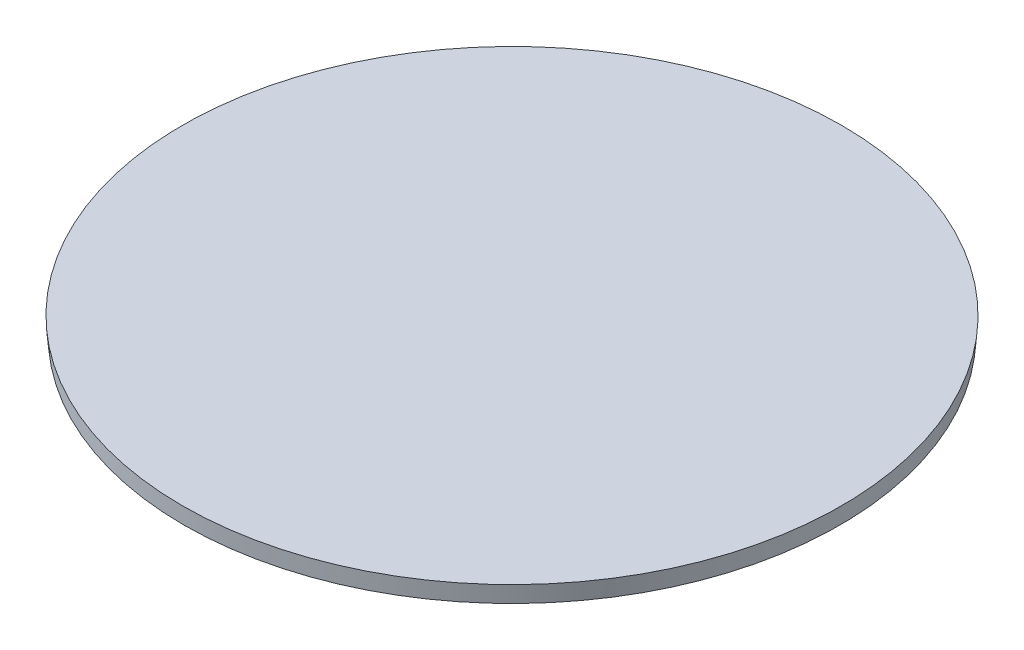
ISO-10303-21;
HEADER;
FILE_DESCRIPTION(('STEP AP214'),'2;1');
FILE_NAME('part.step','',(''),(''),'','','');
FILE_SCHEMA(('AUTOMOTIVE_DESIGN { 1 0 10303 214 1 1 1 1 }'));
ENDSEC;
DATA;
#1=APPLICATION_CONTEXT('core data for automotive mechanical design processes');
#2=APPLICATION_PROTOCOL_DEFINITION('international standard','automotive_design',2000,#1);
#3=PRODUCT_CONTEXT('',#1,'mechanical');
#4=PRODUCT('Part','Part','',(#3));
#5=PRODUCT_RELATED_PRODUCT_CATEGORY('part','',(#4));
#6=PRODUCT_DEFINITION_FORMATION('','',#4);
#7=PRODUCT_DEFINITION_CONTEXT('part definition',#1,'design');
#8=PRODUCT_DEFINITION('design','',#6,#7);
#9=PRODUCT_DEFINITION_SHAPE('','',#8);
#10=(LENGTH_UNIT() NAMED_UNIT(*) SI_UNIT(.MILLI.,.METRE.));
#11=(NAMED_UNIT(*) PLANE_ANGLE_UNIT() SI_UNIT($,.RADIAN.));
#12=(NAMED_UNIT(*) SI_UNIT($,.STERADIAN.) SOLID_ANGLE_UNIT());
#13=UNCERTAINTY_MEASURE_WITH_UNIT(LENGTH_MEASURE(1.E-05),#10,'distance_accuracy_value','');
#14=(GEOMETRIC_REPRESENTATION_CONTEXT(3) GLOBAL_UNCERTAINTY_ASSIGNED_CONTEXT((#13)) GLOBAL_UNIT_ASSIGNED_CONTEXT((#10,
#11,#12)) REPRESENTATION_CONTEXT('',''));
#15=CARTESIAN_POINT('',(0.,0.,0.));
#16=DIRECTION('',(0.,0.,1.));
#17=DIRECTION('',(1.,0.,0.));
#18=AXIS2_PLACEMENT_3D('',#15,#16,#17);
#19=CARTESIAN_POINT('',(0.,0.,0.));
#20=DIRECTION('',(0.,1.,0.));
#21=DIRECTION('',(0.,0.,1.));
#22=AXIS2_PLACEMENT_3D('',#19,#20,#21);
#23=CONICAL_SURFACE('',#22,18.85,0.0872664625997167);
#24=CARTESIAN_POINT('',(0.,-1.,0.));
#25=DIRECTION('',(0.,1.,0.));
#26=DIRECTION('',(0.,0.,1.));
#27=AXIS2_PLACEMENT_3D('',#24,#25,#26);
#28=CIRCLE('',#27,18.7625113364741);
#29=CARTESIAN_POINT('',(0.,-1.,18.7625113364741));
#30=VERTEX_POINT('',#29);
#31=EDGE_CURVE('E10',#30,#30,#28,.T.);
#32=ORIENTED_EDGE('',*,*,#31,.T.);
#33=EDGE_LOOP('',(#32));
#34=FACE_BOUND('',#33,.T.);
#35=CARTESIAN_POINT('',(0.,0.,0.));
#36=DIRECTION('',(0.,1.,0.));
#37=DIRECTION('',(0.,0.,1.));
#38=AXIS2_PLACEMENT_3D('',#35,#36,#37);
#39=CIRCLE('',#38,18.85);
#40=CARTESIAN_POINT('',(0.,0.,18.85));
#41=VERTEX_POINT('',#40);
#42=EDGE_CURVE('E43',#41,#41,#39,.T.);
#43=ORIENTED_EDGE('',*,*,#42,.F.);
#44=EDGE_LOOP('',(#43));
#45=FACE_BOUND('',#44,.T.);
#46=ADVANCED_FACE('F37',(#34,#45),#23,.T.);
#47=CARTESIAN_POINT('',(0.,-1.,0.));
#48=DIRECTION('',(0.,1.,0.));
#49=DIRECTION('',(0.,0.,1.));
#50=AXIS2_PLACEMENT_3D('',#47,#48,#49);
#51=PLANE('',#50);
#52=ORIENTED_EDGE('',*,*,#31,.F.);
#53=EDGE_LOOP('',(#52));
#54=FACE_BOUND('',#53,.T.);
#55=ADVANCED_FACE('F52',(#54),#51,.F.);
#56=CARTESIAN_POINT('',(0.,0.,0.));
#57=DIRECTION('',(0.,1.,0.));
#58=DIRECTION('',(0.,0.,1.));
#59=AXIS2_PLACEMENT_3D('',#56,#57,#58);
#60=PLANE('',#59);
#61=ORIENTED_EDGE('',*,*,#42,.T.);
#62=EDGE_LOOP('',(#61));
#63=FACE_BOUND('',#62,.T.);
#64=ADVANCED_FACE('F49',(#63),#60,.T.);
#65=CLOSED_SHELL('',(#46,#55,#64));
#66=MANIFOLD_SOLID_BREP('B2',#65);
#67=ADVANCED_BREP_SHAPE_REPRESENTATION('',(#18,#66),#14);
#68=SHAPE_DEFINITION_REPRESENTATION(#9,#67);
ENDSEC;
END-ISO-10303-21;
